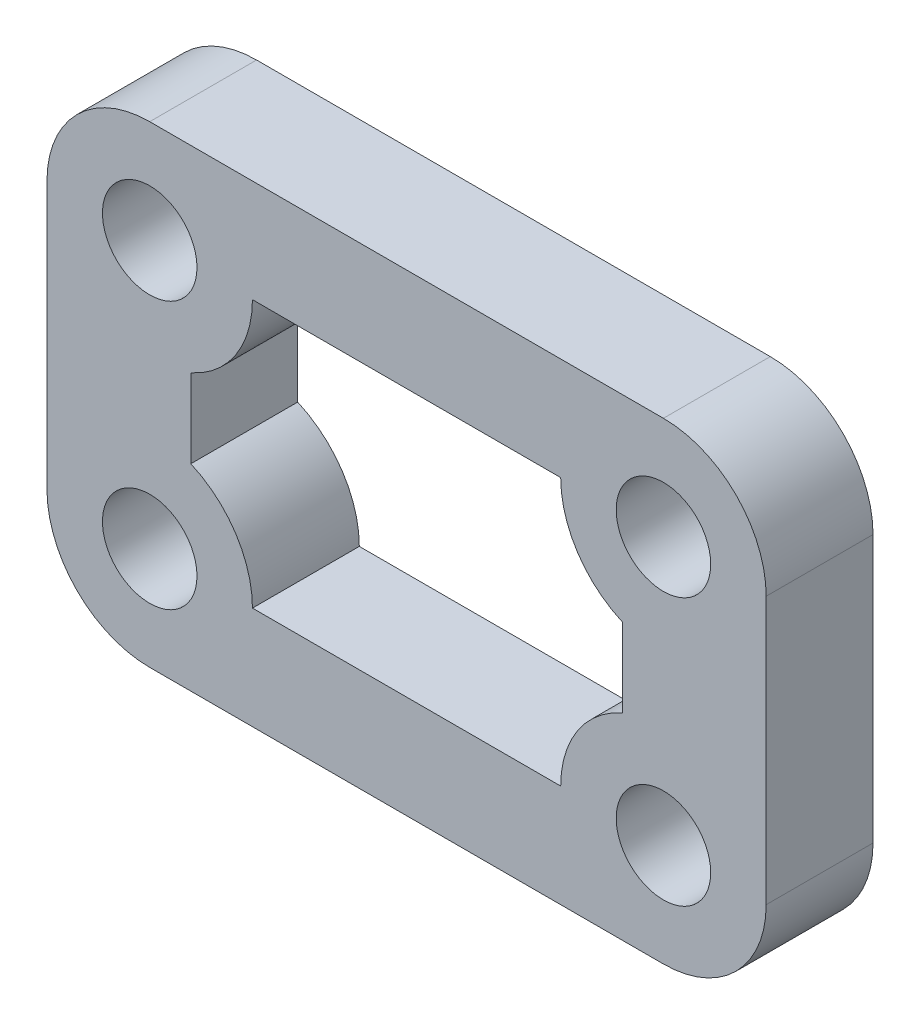
ISO-10303-21;
HEADER;
FILE_DESCRIPTION(('STEP AP214'),'2;1');
FILE_NAME('part.step','',(''),(''),'','','');
FILE_SCHEMA(('AUTOMOTIVE_DESIGN { 1 0 10303 214 1 1 1 1 }'));
ENDSEC;
DATA;
#1=APPLICATION_CONTEXT('core data for automotive mechanical design processes');
#2=APPLICATION_PROTOCOL_DEFINITION('international standard','automotive_design',2000,#1);
#3=PRODUCT_CONTEXT('',#1,'mechanical');
#4=PRODUCT('Part','Part','',(#3));
#5=PRODUCT_RELATED_PRODUCT_CATEGORY('part','',(#4));
#6=PRODUCT_DEFINITION_FORMATION('','',#4);
#7=PRODUCT_DEFINITION_CONTEXT('part definition',#1,'design');
#8=PRODUCT_DEFINITION('design','',#6,#7);
#9=PRODUCT_DEFINITION_SHAPE('','',#8);
#10=(LENGTH_UNIT() NAMED_UNIT(*) SI_UNIT(.MILLI.,.METRE.));
#11=(NAMED_UNIT(*) PLANE_ANGLE_UNIT() SI_UNIT($,.RADIAN.));
#12=(NAMED_UNIT(*) SI_UNIT($,.STERADIAN.) SOLID_ANGLE_UNIT());
#13=UNCERTAINTY_MEASURE_WITH_UNIT(LENGTH_MEASURE(1.E-05),#10,'distance_accuracy_value','');
#14=(GEOMETRIC_REPRESENTATION_CONTEXT(3) GLOBAL_UNCERTAINTY_ASSIGNED_CONTEXT((#13)) GLOBAL_UNIT_ASSIGNED_CONTEXT((#10,
#11,#12)) REPRESENTATION_CONTEXT('',''));
#15=CARTESIAN_POINT('',(0.,0.,0.));
#16=DIRECTION('',(0.,0.,1.));
#17=DIRECTION('',(1.,0.,0.));
#18=AXIS2_PLACEMENT_3D('',#15,#16,#17);
#19=CARTESIAN_POINT('',(0.,13.,5.2));
#20=DIRECTION('',(0.,0.,1.));
#21=DIRECTION('',(1.,0.,0.));
#22=AXIS2_PLACEMENT_3D('',#19,#20,#21);
#23=PLANE('',#22);
#24=CARTESIAN_POINT('',(0.,0.,5.2));
#25=DIRECTION('',(0.,0.,1.));
#26=DIRECTION('',(1.,0.,0.));
#27=AXIS2_PLACEMENT_3D('',#24,#25,#26);
#28=CIRCLE('',#27,2.3);
#29=CARTESIAN_POINT('',(2.3,0.,5.2));
#30=VERTEX_POINT('',#29);
#31=EDGE_CURVE('E220',#30,#30,#28,.T.);
#32=ORIENTED_EDGE('',*,*,#31,.F.);
#33=EDGE_LOOP('',(#32));
#34=FACE_BOUND('',#33,.T.);
#35=CARTESIAN_POINT('',(0.,13.,5.2));
#36=DIRECTION('',(0.,0.,1.));
#37=DIRECTION('',(1.,0.,0.));
#38=AXIS2_PLACEMENT_3D('',#35,#36,#37);
#39=CIRCLE('',#38,2.3);
#40=CARTESIAN_POINT('',(2.3,13.,5.2));
#41=VERTEX_POINT('',#40);
#42=EDGE_CURVE('E232',#41,#41,#39,.T.);
#43=ORIENTED_EDGE('',*,*,#42,.F.);
#44=EDGE_LOOP('',(#43));
#45=FACE_BOUND('',#44,.T.);
#46=CARTESIAN_POINT('',(0.,13.,5.2));
#47=DIRECTION('',(0.,0.,1.));
#48=DIRECTION('',(1.,0.,0.));
#49=AXIS2_PLACEMENT_3D('',#46,#47,#48);
#50=CIRCLE('',#49,5.);
#51=CARTESIAN_POINT('',(0.,18.,5.2));
#52=VERTEX_POINT('',#51);
#53=CARTESIAN_POINT('',(-5.,13.,5.2));
#54=VERTEX_POINT('',#53);
#55=EDGE_CURVE('E238',#52,#54,#50,.T.);
#56=ORIENTED_EDGE('',*,*,#55,.T.);
#57=DIRECTION('',(0.,-1.,0.));
#58=VECTOR('',#57,1.);
#59=CARTESIAN_POINT('',(-5.,13.,5.2));
#60=LINE('',#59,#58);
#61=CARTESIAN_POINT('',(-5.,0.,5.2));
#62=VERTEX_POINT('',#61);
#63=EDGE_CURVE('E241',#54,#62,#60,.T.);
#64=ORIENTED_EDGE('',*,*,#63,.T.);
#65=CARTESIAN_POINT('',(0.,0.,5.2));
#66=DIRECTION('',(0.,0.,1.));
#67=DIRECTION('',(1.,0.,0.));
#68=AXIS2_PLACEMENT_3D('',#65,#66,#67);
#69=CIRCLE('',#68,5.);
#70=CARTESIAN_POINT('',(0.,-5.,5.2));
#71=VERTEX_POINT('',#70);
#72=EDGE_CURVE('E244',#62,#71,#69,.T.);
#73=ORIENTED_EDGE('',*,*,#72,.T.);
#74=DIRECTION('',(1.,0.,0.));
#75=VECTOR('',#74,1.);
#76=CARTESIAN_POINT('',(0.,-5.,5.2));
#77=LINE('',#76,#75);
#78=CARTESIAN_POINT('',(25.,-5.,5.2));
#79=VERTEX_POINT('',#78);
#80=EDGE_CURVE('E246',#71,#79,#77,.T.);
#81=ORIENTED_EDGE('',*,*,#80,.T.);
#82=CARTESIAN_POINT('',(25.,0.,5.2));
#83=DIRECTION('',(0.,0.,1.));
#84=DIRECTION('',(1.,0.,0.));
#85=AXIS2_PLACEMENT_3D('',#82,#83,#84);
#86=CIRCLE('',#85,5.);
#87=CARTESIAN_POINT('',(30.,0.,5.2));
#88=VERTEX_POINT('',#87);
#89=EDGE_CURVE('E248',#79,#88,#86,.T.);
#90=ORIENTED_EDGE('',*,*,#89,.T.);
#91=DIRECTION('',(0.,1.,0.));
#92=VECTOR('',#91,1.);
#93=CARTESIAN_POINT('',(30.,13.,5.2));
#94=LINE('',#93,#92);
#95=CARTESIAN_POINT('',(30.,13.,5.2));
#96=VERTEX_POINT('',#95);
#97=EDGE_CURVE('E250',#88,#96,#94,.T.);
#98=ORIENTED_EDGE('',*,*,#97,.T.);
#99=CARTESIAN_POINT('',(25.,13.,5.2));
#100=DIRECTION('',(0.,0.,1.));
#101=DIRECTION('',(1.,0.,0.));
#102=AXIS2_PLACEMENT_3D('',#99,#100,#101);
#103=CIRCLE('',#102,5.);
#104=CARTESIAN_POINT('',(25.,18.,5.2));
#105=VERTEX_POINT('',#104);
#106=EDGE_CURVE('E252',#96,#105,#103,.T.);
#107=ORIENTED_EDGE('',*,*,#106,.T.);
#108=DIRECTION('',(-1.,0.,0.));
#109=VECTOR('',#108,1.);
#110=CARTESIAN_POINT('',(25.,18.,5.2));
#111=LINE('',#110,#109);
#112=EDGE_CURVE('E254',#105,#52,#111,.T.);
#113=ORIENTED_EDGE('',*,*,#112,.T.);
#114=EDGE_LOOP('',(#56,#64,#73,#81,#90,#98,#107,#113));
#115=FACE_BOUND('',#114,.T.);
#116=CARTESIAN_POINT('',(25.,13.,5.2));
#117=DIRECTION('',(0.,0.,1.));
#118=DIRECTION('',(1.,0.,0.));
#119=AXIS2_PLACEMENT_3D('',#116,#117,#118);
#120=CIRCLE('',#119,2.3);
#121=CARTESIAN_POINT('',(27.3,13.,5.2));
#122=VERTEX_POINT('',#121);
#123=EDGE_CURVE('E226',#122,#122,#120,.T.);
#124=ORIENTED_EDGE('',*,*,#123,.F.);
#125=EDGE_LOOP('',(#124));
#126=FACE_BOUND('',#125,.T.);
#127=CARTESIAN_POINT('',(25.,0.,5.2));
#128=DIRECTION('',(0.,0.,1.));
#129=DIRECTION('',(1.,0.,0.));
#130=AXIS2_PLACEMENT_3D('',#127,#128,#129);
#131=CIRCLE('',#130,2.3);
#132=CARTESIAN_POINT('',(27.3,0.,5.2));
#133=VERTEX_POINT('',#132);
#134=EDGE_CURVE('E214',#133,#133,#131,.T.);
#135=ORIENTED_EDGE('',*,*,#134,.F.);
#136=EDGE_LOOP('',(#135));
#137=FACE_BOUND('',#136,.T.);
#138=DIRECTION('',(0.,-1.,0.));
#139=VECTOR('',#138,1.);
#140=CARTESIAN_POINT('',(2.,8.41742430504416,5.2));
#141=LINE('',#140,#139);
#142=CARTESIAN_POINT('',(2.,8.41742430504416,5.2));
#143=VERTEX_POINT('',#142);
#144=CARTESIAN_POINT('',(2.,4.58257569495584,5.2));
#145=VERTEX_POINT('',#144);
#146=EDGE_CURVE('E157',#143,#145,#141,.T.);
#147=ORIENTED_EDGE('',*,*,#146,.F.);
#148=CARTESIAN_POINT('',(0.,13.,5.2));
#149=DIRECTION('',(0.,0.,-1.));
#150=DIRECTION('',(1.,0.,0.));
#151=AXIS2_PLACEMENT_3D('',#148,#149,#150);
#152=CIRCLE('',#151,5.);
#153=CARTESIAN_POINT('',(5.,13.,5.2));
#154=VERTEX_POINT('',#153);
#155=EDGE_CURVE('E149',#154,#143,#152,.T.);
#156=ORIENTED_EDGE('',*,*,#155,.F.);
#157=DIRECTION('',(-1.,0.,0.));
#158=VECTOR('',#157,1.);
#159=CARTESIAN_POINT('',(5.,13.,5.2));
#160=LINE('',#159,#158);
#161=CARTESIAN_POINT('',(20.,13.,5.2));
#162=VERTEX_POINT('',#161);
#163=EDGE_CURVE('E182',#162,#154,#160,.T.);
#164=ORIENTED_EDGE('',*,*,#163,.F.);
#165=CARTESIAN_POINT('',(25.,13.,5.2));
#166=DIRECTION('',(0.,0.,-1.));
#167=DIRECTION('',(1.,0.,0.));
#168=AXIS2_PLACEMENT_3D('',#165,#166,#167);
#169=CIRCLE('',#168,5.);
#170=CARTESIAN_POINT('',(23.,8.41742430504416,5.2));
#171=VERTEX_POINT('',#170);
#172=EDGE_CURVE('E180',#171,#162,#169,.T.);
#173=ORIENTED_EDGE('',*,*,#172,.F.);
#174=DIRECTION('',(0.,1.,0.));
#175=VECTOR('',#174,1.);
#176=CARTESIAN_POINT('',(23.,8.41742430504416,5.2));
#177=LINE('',#176,#175);
#178=CARTESIAN_POINT('',(23.,4.58257569495584,5.2));
#179=VERTEX_POINT('',#178);
#180=EDGE_CURVE('E178',#179,#171,#177,.T.);
#181=ORIENTED_EDGE('',*,*,#180,.F.);
#182=CARTESIAN_POINT('',(25.,0.,5.2));
#183=DIRECTION('',(0.,0.,-1.));
#184=DIRECTION('',(1.,0.,0.));
#185=AXIS2_PLACEMENT_3D('',#182,#183,#184);
#186=CIRCLE('',#185,5.);
#187=CARTESIAN_POINT('',(20.,0.,5.2));
#188=VERTEX_POINT('',#187);
#189=EDGE_CURVE('E176',#188,#179,#186,.T.);
#190=ORIENTED_EDGE('',*,*,#189,.F.);
#191=DIRECTION('',(1.,0.,0.));
#192=VECTOR('',#191,1.);
#193=CARTESIAN_POINT('',(5.,0.,5.2));
#194=LINE('',#193,#192);
#195=CARTESIAN_POINT('',(5.,0.,5.2));
#196=VERTEX_POINT('',#195);
#197=EDGE_CURVE('E172',#196,#188,#194,.T.);
#198=ORIENTED_EDGE('',*,*,#197,.F.);
#199=CARTESIAN_POINT('',(0.,0.,5.2));
#200=DIRECTION('',(0.,0.,-1.));
#201=DIRECTION('',(1.,0.,0.));
#202=AXIS2_PLACEMENT_3D('',#199,#200,#201);
#203=CIRCLE('',#202,5.);
#204=EDGE_CURVE('E170',#145,#196,#203,.T.);
#205=ORIENTED_EDGE('',*,*,#204,.F.);
#206=EDGE_LOOP('',(#147,#156,#164,#173,#181,#190,#198,#205));
#207=FACE_BOUND('',#206,.T.);
#208=ADVANCED_FACE('F36',(#34,#45,#115,#126,#137,#207),#23,.T.);
#209=CARTESIAN_POINT('',(0.,13.,0.));
#210=DIRECTION('',(0.,0.,1.));
#211=DIRECTION('',(1.,0.,0.));
#212=AXIS2_PLACEMENT_3D('',#209,#210,#211);
#213=PLANE('',#212);
#214=CARTESIAN_POINT('',(25.,0.,0.));
#215=DIRECTION('',(0.,0.,1.));
#216=DIRECTION('',(1.,0.,0.));
#217=AXIS2_PLACEMENT_3D('',#214,#215,#216);
#218=CIRCLE('',#217,2.3);
#219=CARTESIAN_POINT('',(27.3,0.,0.));
#220=VERTEX_POINT('',#219);
#221=EDGE_CURVE('E165',#220,#220,#218,.T.);
#222=ORIENTED_EDGE('',*,*,#221,.T.);
#223=EDGE_LOOP('',(#222));
#224=FACE_BOUND('',#223,.T.);
#225=CARTESIAN_POINT('',(0.,0.,0.));
#226=DIRECTION('',(0.,0.,1.));
#227=DIRECTION('',(1.,0.,0.));
#228=AXIS2_PLACEMENT_3D('',#225,#226,#227);
#229=CIRCLE('',#228,2.3);
#230=CARTESIAN_POINT('',(2.3,0.,0.));
#231=VERTEX_POINT('',#230);
#232=EDGE_CURVE('E217',#231,#231,#229,.T.);
#233=ORIENTED_EDGE('',*,*,#232,.T.);
#234=EDGE_LOOP('',(#233));
#235=FACE_BOUND('',#234,.T.);
#236=CARTESIAN_POINT('',(25.,13.,0.));
#237=DIRECTION('',(0.,0.,1.));
#238=DIRECTION('',(1.,0.,0.));
#239=AXIS2_PLACEMENT_3D('',#236,#237,#238);
#240=CIRCLE('',#239,2.3);
#241=CARTESIAN_POINT('',(27.3,13.,0.));
#242=VERTEX_POINT('',#241);
#243=EDGE_CURVE('E223',#242,#242,#240,.T.);
#244=ORIENTED_EDGE('',*,*,#243,.T.);
#245=EDGE_LOOP('',(#244));
#246=FACE_BOUND('',#245,.T.);
#247=CARTESIAN_POINT('',(0.,13.,0.));
#248=DIRECTION('',(0.,0.,1.));
#249=DIRECTION('',(1.,0.,0.));
#250=AXIS2_PLACEMENT_3D('',#247,#248,#249);
#251=CIRCLE('',#250,2.3);
#252=CARTESIAN_POINT('',(2.3,13.,0.));
#253=VERTEX_POINT('',#252);
#254=EDGE_CURVE('E229',#253,#253,#251,.T.);
#255=ORIENTED_EDGE('',*,*,#254,.T.);
#256=EDGE_LOOP('',(#255));
#257=FACE_BOUND('',#256,.T.);
#258=CARTESIAN_POINT('',(0.,13.,0.));
#259=DIRECTION('',(0.,0.,1.));
#260=DIRECTION('',(1.,0.,0.));
#261=AXIS2_PLACEMENT_3D('',#258,#259,#260);
#262=CIRCLE('',#261,5.);
#263=CARTESIAN_POINT('',(0.,18.,0.));
#264=VERTEX_POINT('',#263);
#265=CARTESIAN_POINT('',(-5.,13.,0.));
#266=VERTEX_POINT('',#265);
#267=EDGE_CURVE('E235',#264,#266,#262,.T.);
#268=ORIENTED_EDGE('',*,*,#267,.F.);
#269=DIRECTION('',(-1.,0.,0.));
#270=VECTOR('',#269,1.);
#271=CARTESIAN_POINT('',(25.,18.,0.));
#272=LINE('',#271,#270);
#273=CARTESIAN_POINT('',(25.,18.,0.));
#274=VERTEX_POINT('',#273);
#275=EDGE_CURVE('E242',#274,#264,#272,.T.);
#276=ORIENTED_EDGE('',*,*,#275,.F.);
#277=CARTESIAN_POINT('',(25.,13.,0.));
#278=DIRECTION('',(0.,0.,1.));
#279=DIRECTION('',(1.,0.,0.));
#280=AXIS2_PLACEMENT_3D('',#277,#278,#279);
#281=CIRCLE('',#280,5.);
#282=CARTESIAN_POINT('',(30.,13.,0.));
#283=VERTEX_POINT('',#282);
#284=EDGE_CURVE('E269',#283,#274,#281,.T.);
#285=ORIENTED_EDGE('',*,*,#284,.F.);
#286=DIRECTION('',(0.,1.,0.));
#287=VECTOR('',#286,1.);
#288=CARTESIAN_POINT('',(30.,13.,0.));
#289=LINE('',#288,#287);
#290=CARTESIAN_POINT('',(30.,0.,0.));
#291=VERTEX_POINT('',#290);
#292=EDGE_CURVE('E267',#291,#283,#289,.T.);
#293=ORIENTED_EDGE('',*,*,#292,.F.);
#294=CARTESIAN_POINT('',(25.,0.,0.));
#295=DIRECTION('',(0.,0.,1.));
#296=DIRECTION('',(1.,0.,0.));
#297=AXIS2_PLACEMENT_3D('',#294,#295,#296);
#298=CIRCLE('',#297,5.);
#299=CARTESIAN_POINT('',(25.,-5.,0.));
#300=VERTEX_POINT('',#299);
#301=EDGE_CURVE('E265',#300,#291,#298,.T.);
#302=ORIENTED_EDGE('',*,*,#301,.F.);
#303=DIRECTION('',(1.,0.,0.));
#304=VECTOR('',#303,1.);
#305=CARTESIAN_POINT('',(0.,-5.,0.));
#306=LINE('',#305,#304);
#307=CARTESIAN_POINT('',(0.,-5.,0.));
#308=VERTEX_POINT('',#307);
#309=EDGE_CURVE('E263',#308,#300,#306,.T.);
#310=ORIENTED_EDGE('',*,*,#309,.F.);
#311=CARTESIAN_POINT('',(0.,0.,0.));
#312=DIRECTION('',(0.,0.,1.));
#313=DIRECTION('',(1.,0.,0.));
#314=AXIS2_PLACEMENT_3D('',#311,#312,#313);
#315=CIRCLE('',#314,5.);
#316=CARTESIAN_POINT('',(-5.,0.,0.));
#317=VERTEX_POINT('',#316);
#318=EDGE_CURVE('E261',#317,#308,#315,.T.);
#319=ORIENTED_EDGE('',*,*,#318,.F.);
#320=DIRECTION('',(0.,-1.,0.));
#321=VECTOR('',#320,1.);
#322=CARTESIAN_POINT('',(-5.,13.,0.));
#323=LINE('',#322,#321);
#324=EDGE_CURVE('E259',#266,#317,#323,.T.);
#325=ORIENTED_EDGE('',*,*,#324,.F.);
#326=EDGE_LOOP('',(#268,#276,#285,#293,#302,#310,#319,#325));
#327=FACE_BOUND('',#326,.T.);
#328=CARTESIAN_POINT('',(0.,13.,0.));
#329=DIRECTION('',(0.,0.,-1.));
#330=DIRECTION('',(1.,0.,0.));
#331=AXIS2_PLACEMENT_3D('',#328,#329,#330);
#332=CIRCLE('',#331,5.);
#333=CARTESIAN_POINT('',(5.,13.,0.));
#334=VERTEX_POINT('',#333);
#335=CARTESIAN_POINT('',(2.,8.41742430504416,0.));
#336=VERTEX_POINT('',#335);
#337=EDGE_CURVE('E59',#334,#336,#332,.T.);
#338=ORIENTED_EDGE('',*,*,#337,.T.);
#339=DIRECTION('',(0.,-1.,0.));
#340=VECTOR('',#339,1.);
#341=CARTESIAN_POINT('',(2.,8.41742430504416,0.));
#342=LINE('',#341,#340);
#343=CARTESIAN_POINT('',(2.,4.58257569495584,0.));
#344=VERTEX_POINT('',#343);
#345=EDGE_CURVE('E164',#336,#344,#342,.T.);
#346=ORIENTED_EDGE('',*,*,#345,.T.);
#347=CARTESIAN_POINT('',(0.,0.,0.));
#348=DIRECTION('',(0.,0.,-1.));
#349=DIRECTION('',(1.,0.,0.));
#350=AXIS2_PLACEMENT_3D('',#347,#348,#349);
#351=CIRCLE('',#350,5.);
#352=CARTESIAN_POINT('',(5.,0.,0.));
#353=VERTEX_POINT('',#352);
#354=EDGE_CURVE('E186',#344,#353,#351,.T.);
#355=ORIENTED_EDGE('',*,*,#354,.T.);
#356=DIRECTION('',(1.,0.,0.));
#357=VECTOR('',#356,1.);
#358=CARTESIAN_POINT('',(5.,0.,0.));
#359=LINE('',#358,#357);
#360=CARTESIAN_POINT('',(20.,0.,0.));
#361=VERTEX_POINT('',#360);
#362=EDGE_CURVE('E189',#353,#361,#359,.T.);
#363=ORIENTED_EDGE('',*,*,#362,.T.);
#364=CARTESIAN_POINT('',(25.,0.,0.));
#365=DIRECTION('',(0.,0.,-1.));
#366=DIRECTION('',(1.,0.,0.));
#367=AXIS2_PLACEMENT_3D('',#364,#365,#366);
#368=CIRCLE('',#367,5.);
#369=CARTESIAN_POINT('',(23.,4.58257569495584,0.));
#370=VERTEX_POINT('',#369);
#371=EDGE_CURVE('E192',#361,#370,#368,.T.);
#372=ORIENTED_EDGE('',*,*,#371,.T.);
#373=DIRECTION('',(0.,1.,0.));
#374=VECTOR('',#373,1.);
#375=CARTESIAN_POINT('',(23.,8.41742430504416,0.));
#376=LINE('',#375,#374);
#377=CARTESIAN_POINT('',(23.,8.41742430504416,0.));
#378=VERTEX_POINT('',#377);
#379=EDGE_CURVE('E195',#370,#378,#376,.T.);
#380=ORIENTED_EDGE('',*,*,#379,.T.);
#381=CARTESIAN_POINT('',(25.,13.,0.));
#382=DIRECTION('',(0.,0.,-1.));
#383=DIRECTION('',(1.,0.,0.));
#384=AXIS2_PLACEMENT_3D('',#381,#382,#383);
#385=CIRCLE('',#384,5.);
#386=CARTESIAN_POINT('',(20.,13.,0.));
#387=VERTEX_POINT('',#386);
#388=EDGE_CURVE('E198',#378,#387,#385,.T.);
#389=ORIENTED_EDGE('',*,*,#388,.T.);
#390=DIRECTION('',(-1.,0.,0.));
#391=VECTOR('',#390,1.);
#392=CARTESIAN_POINT('',(5.,13.,0.));
#393=LINE('',#392,#391);
#394=EDGE_CURVE('E158',#387,#334,#393,.T.);
#395=ORIENTED_EDGE('',*,*,#394,.T.);
#396=EDGE_LOOP('',(#338,#346,#355,#363,#372,#380,#389,#395));
#397=FACE_BOUND('',#396,.T.);
#398=ADVANCED_FACE('F299',(#224,#235,#246,#257,#327,#397),#213,.F.);
#399=CARTESIAN_POINT('',(0.,13.,5.2));
#400=DIRECTION('',(0.,0.,-1.));
#401=DIRECTION('',(-1.,0.,0.));
#402=AXIS2_PLACEMENT_3D('',#399,#400,#401);
#403=CYLINDRICAL_SURFACE('',#402,5.);
#404=ORIENTED_EDGE('',*,*,#267,.T.);
#405=DIRECTION('',(0.,0.,-1.));
#406=VECTOR('',#405,1.);
#407=CARTESIAN_POINT('',(-5.,13.,5.2));
#408=LINE('',#407,#406);
#409=EDGE_CURVE('E11',#54,#266,#408,.T.);
#410=ORIENTED_EDGE('',*,*,#409,.F.);
#411=ORIENTED_EDGE('',*,*,#55,.F.);
#412=DIRECTION('',(0.,0.,-1.));
#413=VECTOR('',#412,1.);
#414=CARTESIAN_POINT('',(0.,18.,5.2));
#415=LINE('',#414,#413);
#416=EDGE_CURVE('E256',#52,#264,#415,.T.);
#417=ORIENTED_EDGE('',*,*,#416,.T.);
#418=EDGE_LOOP('',(#404,#410,#411,#417));
#419=FACE_BOUND('',#418,.T.);
#420=ADVANCED_FACE('F38',(#419),#403,.T.);
#421=CARTESIAN_POINT('',(-5.,13.,5.2));
#422=DIRECTION('',(1.,0.,0.));
#423=DIRECTION('',(0.,1.,0.));
#424=AXIS2_PLACEMENT_3D('',#421,#422,#423);
#425=PLANE('',#424);
#426=ORIENTED_EDGE('',*,*,#324,.T.);
#427=DIRECTION('',(0.,0.,-1.));
#428=VECTOR('',#427,1.);
#429=CARTESIAN_POINT('',(-5.,0.,5.2));
#430=LINE('',#429,#428);
#431=EDGE_CURVE('E44',#62,#317,#430,.T.);
#432=ORIENTED_EDGE('',*,*,#431,.F.);
#433=ORIENTED_EDGE('',*,*,#63,.F.);
#434=ORIENTED_EDGE('',*,*,#409,.T.);
#435=EDGE_LOOP('',(#426,#432,#433,#434));
#436=FACE_BOUND('',#435,.T.);
#437=ADVANCED_FACE('F317',(#436),#425,.F.);
#438=CARTESIAN_POINT('',(0.,0.,5.2));
#439=DIRECTION('',(0.,0.,-1.));
#440=DIRECTION('',(-1.,0.,0.));
#441=AXIS2_PLACEMENT_3D('',#438,#439,#440);
#442=CYLINDRICAL_SURFACE('',#441,5.);
#443=ORIENTED_EDGE('',*,*,#318,.T.);
#444=DIRECTION('',(0.,0.,-1.));
#445=VECTOR('',#444,1.);
#446=CARTESIAN_POINT('',(0.,-5.,5.2));
#447=LINE('',#446,#445);
#448=EDGE_CURVE('E286',#71,#308,#447,.T.);
#449=ORIENTED_EDGE('',*,*,#448,.F.);
#450=ORIENTED_EDGE('',*,*,#72,.F.);
#451=ORIENTED_EDGE('',*,*,#431,.T.);
#452=EDGE_LOOP('',(#443,#449,#450,#451));
#453=FACE_BOUND('',#452,.T.);
#454=ADVANCED_FACE('F293',(#453),#442,.T.);
#455=CARTESIAN_POINT('',(0.,-5.,5.2));
#456=DIRECTION('',(0.,1.,0.));
#457=DIRECTION('',(0.,0.,1.));
#458=AXIS2_PLACEMENT_3D('',#455,#456,#457);
#459=PLANE('',#458);
#460=ORIENTED_EDGE('',*,*,#309,.T.);
#461=DIRECTION('',(0.,0.,-1.));
#462=VECTOR('',#461,1.);
#463=CARTESIAN_POINT('',(25.,-5.,5.2));
#464=LINE('',#463,#462);
#465=EDGE_CURVE('E283',#79,#300,#464,.T.);
#466=ORIENTED_EDGE('',*,*,#465,.F.);
#467=ORIENTED_EDGE('',*,*,#80,.F.);
#468=ORIENTED_EDGE('',*,*,#448,.T.);
#469=EDGE_LOOP('',(#460,#466,#467,#468));
#470=FACE_BOUND('',#469,.T.);
#471=ADVANCED_FACE('F305',(#470),#459,.F.);
#472=CARTESIAN_POINT('',(25.,0.,5.2));
#473=DIRECTION('',(0.,0.,-1.));
#474=DIRECTION('',(-1.,0.,0.));
#475=AXIS2_PLACEMENT_3D('',#472,#473,#474);
#476=CYLINDRICAL_SURFACE('',#475,5.);
#477=ORIENTED_EDGE('',*,*,#301,.T.);
#478=DIRECTION('',(0.,0.,-1.));
#479=VECTOR('',#478,1.);
#480=CARTESIAN_POINT('',(30.,0.,5.2));
#481=LINE('',#480,#479);
#482=EDGE_CURVE('E280',#88,#291,#481,.T.);
#483=ORIENTED_EDGE('',*,*,#482,.F.);
#484=ORIENTED_EDGE('',*,*,#89,.F.);
#485=ORIENTED_EDGE('',*,*,#465,.T.);
#486=EDGE_LOOP('',(#477,#483,#484,#485));
#487=FACE_BOUND('',#486,.T.);
#488=ADVANCED_FACE('F309',(#487),#476,.T.);
#489=CARTESIAN_POINT('',(30.,13.,5.2));
#490=DIRECTION('',(-1.,0.,0.));
#491=DIRECTION('',(0.,0.,1.));
#492=AXIS2_PLACEMENT_3D('',#489,#490,#491);
#493=PLANE('',#492);
#494=ORIENTED_EDGE('',*,*,#292,.T.);
#495=DIRECTION('',(0.,0.,-1.));
#496=VECTOR('',#495,1.);
#497=CARTESIAN_POINT('',(30.,13.,5.2));
#498=LINE('',#497,#496);
#499=EDGE_CURVE('E277',#96,#283,#498,.T.);
#500=ORIENTED_EDGE('',*,*,#499,.F.);
#501=ORIENTED_EDGE('',*,*,#97,.F.);
#502=ORIENTED_EDGE('',*,*,#482,.T.);
#503=EDGE_LOOP('',(#494,#500,#501,#502));
#504=FACE_BOUND('',#503,.T.);
#505=ADVANCED_FACE('F330',(#504),#493,.F.);
#506=CARTESIAN_POINT('',(25.,13.,5.2));
#507=DIRECTION('',(0.,0.,-1.));
#508=DIRECTION('',(-1.,0.,0.));
#509=AXIS2_PLACEMENT_3D('',#506,#507,#508);
#510=CYLINDRICAL_SURFACE('',#509,5.);
#511=ORIENTED_EDGE('',*,*,#284,.T.);
#512=DIRECTION('',(0.,0.,-1.));
#513=VECTOR('',#512,1.);
#514=CARTESIAN_POINT('',(25.,18.,5.2));
#515=LINE('',#514,#513);
#516=EDGE_CURVE('E274',#105,#274,#515,.T.);
#517=ORIENTED_EDGE('',*,*,#516,.F.);
#518=ORIENTED_EDGE('',*,*,#106,.F.);
#519=ORIENTED_EDGE('',*,*,#499,.T.);
#520=EDGE_LOOP('',(#511,#517,#518,#519));
#521=FACE_BOUND('',#520,.T.);
#522=ADVANCED_FACE('F328',(#521),#510,.T.);
#523=CARTESIAN_POINT('',(25.,18.,5.2));
#524=DIRECTION('',(0.,-1.,0.));
#525=DIRECTION('',(0.,0.,-1.));
#526=AXIS2_PLACEMENT_3D('',#523,#524,#525);
#527=PLANE('',#526);
#528=ORIENTED_EDGE('',*,*,#275,.T.);
#529=ORIENTED_EDGE('',*,*,#416,.F.);
#530=ORIENTED_EDGE('',*,*,#112,.F.);
#531=ORIENTED_EDGE('',*,*,#516,.T.);
#532=EDGE_LOOP('',(#528,#529,#530,#531));
#533=FACE_BOUND('',#532,.T.);
#534=ADVANCED_FACE('F323',(#533),#527,.F.);
#535=CARTESIAN_POINT('',(0.,13.,5.2));
#536=DIRECTION('',(0.,0.,-1.));
#537=DIRECTION('',(-1.,0.,0.));
#538=AXIS2_PLACEMENT_3D('',#535,#536,#537);
#539=CYLINDRICAL_SURFACE('',#538,2.3);
#540=ORIENTED_EDGE('',*,*,#42,.T.);
#541=EDGE_LOOP('',(#540));
#542=FACE_BOUND('',#541,.T.);
#543=ORIENTED_EDGE('',*,*,#254,.F.);
#544=EDGE_LOOP('',(#543));
#545=FACE_BOUND('',#544,.T.);
#546=ADVANCED_FACE('F350',(#542,#545),#539,.F.);
#547=CARTESIAN_POINT('',(25.,13.,5.2));
#548=DIRECTION('',(0.,0.,-1.));
#549=DIRECTION('',(-1.,0.,0.));
#550=AXIS2_PLACEMENT_3D('',#547,#548,#549);
#551=CYLINDRICAL_SURFACE('',#550,2.3);
#552=ORIENTED_EDGE('',*,*,#123,.T.);
#553=EDGE_LOOP('',(#552));
#554=FACE_BOUND('',#553,.T.);
#555=ORIENTED_EDGE('',*,*,#243,.F.);
#556=EDGE_LOOP('',(#555));
#557=FACE_BOUND('',#556,.T.);
#558=ADVANCED_FACE('F357',(#554,#557),#551,.F.);
#559=CARTESIAN_POINT('',(0.,0.,5.2));
#560=DIRECTION('',(0.,0.,-1.));
#561=DIRECTION('',(-1.,0.,0.));
#562=AXIS2_PLACEMENT_3D('',#559,#560,#561);
#563=CYLINDRICAL_SURFACE('',#562,2.3);
#564=ORIENTED_EDGE('',*,*,#31,.T.);
#565=EDGE_LOOP('',(#564));
#566=FACE_BOUND('',#565,.T.);
#567=ORIENTED_EDGE('',*,*,#232,.F.);
#568=EDGE_LOOP('',(#567));
#569=FACE_BOUND('',#568,.T.);
#570=ADVANCED_FACE('F362',(#566,#569),#563,.F.);
#571=CARTESIAN_POINT('',(25.,0.,5.2));
#572=DIRECTION('',(0.,0.,-1.));
#573=DIRECTION('',(-1.,0.,0.));
#574=AXIS2_PLACEMENT_3D('',#571,#572,#573);
#575=CYLINDRICAL_SURFACE('',#574,2.3);
#576=ORIENTED_EDGE('',*,*,#134,.T.);
#577=EDGE_LOOP('',(#576));
#578=FACE_BOUND('',#577,.T.);
#579=ORIENTED_EDGE('',*,*,#221,.F.);
#580=EDGE_LOOP('',(#579));
#581=FACE_BOUND('',#580,.T.);
#582=ADVANCED_FACE('F371',(#578,#581),#575,.F.);
#583=CARTESIAN_POINT('',(0.,13.,5.2));
#584=DIRECTION('',(0.,0.,-1.));
#585=DIRECTION('',(-1.,0.,0.));
#586=AXIS2_PLACEMENT_3D('',#583,#584,#585);
#587=CYLINDRICAL_SURFACE('',#586,5.);
#588=ORIENTED_EDGE('',*,*,#337,.F.);
#589=DIRECTION('',(0.,0.,-1.));
#590=VECTOR('',#589,1.);
#591=CARTESIAN_POINT('',(5.,13.,5.2));
#592=LINE('',#591,#590);
#593=EDGE_CURVE('E153',#154,#334,#592,.T.);
#594=ORIENTED_EDGE('',*,*,#593,.F.);
#595=ORIENTED_EDGE('',*,*,#155,.T.);
#596=DIRECTION('',(0.,0.,-1.));
#597=VECTOR('',#596,1.);
#598=CARTESIAN_POINT('',(2.,8.41742430504416,5.2));
#599=LINE('',#598,#597);
#600=EDGE_CURVE('E152',#143,#336,#599,.T.);
#601=ORIENTED_EDGE('',*,*,#600,.T.);
#602=EDGE_LOOP('',(#588,#594,#595,#601));
#603=FACE_BOUND('',#602,.T.);
#604=ADVANCED_FACE('F151',(#603),#587,.T.);
#605=CARTESIAN_POINT('',(2.,8.41742430504416,5.2));
#606=DIRECTION('',(1.,0.,0.));
#607=DIRECTION('',(0.,0.,-1.));
#608=AXIS2_PLACEMENT_3D('',#605,#606,#607);
#609=PLANE('',#608);
#610=ORIENTED_EDGE('',*,*,#345,.F.);
#611=ORIENTED_EDGE('',*,*,#600,.F.);
#612=ORIENTED_EDGE('',*,*,#146,.T.);
#613=DIRECTION('',(0.,0.,-1.));
#614=VECTOR('',#613,1.);
#615=CARTESIAN_POINT('',(2.,4.58257569495584,5.2));
#616=LINE('',#615,#614);
#617=EDGE_CURVE('E166',#145,#344,#616,.T.);
#618=ORIENTED_EDGE('',*,*,#617,.T.);
#619=EDGE_LOOP('',(#610,#611,#612,#618));
#620=FACE_BOUND('',#619,.T.);
#621=ADVANCED_FACE('F161',(#620),#609,.T.);
#622=CARTESIAN_POINT('',(0.,0.,5.2));
#623=DIRECTION('',(0.,0.,-1.));
#624=DIRECTION('',(-1.,0.,0.));
#625=AXIS2_PLACEMENT_3D('',#622,#623,#624);
#626=CYLINDRICAL_SURFACE('',#625,5.);
#627=ORIENTED_EDGE('',*,*,#354,.F.);
#628=ORIENTED_EDGE('',*,*,#617,.F.);
#629=ORIENTED_EDGE('',*,*,#204,.T.);
#630=DIRECTION('',(0.,0.,-1.));
#631=VECTOR('',#630,1.);
#632=CARTESIAN_POINT('',(5.,0.,5.2));
#633=LINE('',#632,#631);
#634=EDGE_CURVE('E211',#196,#353,#633,.T.);
#635=ORIENTED_EDGE('',*,*,#634,.T.);
#636=EDGE_LOOP('',(#627,#628,#629,#635));
#637=FACE_BOUND('',#636,.T.);
#638=ADVANCED_FACE('F383',(#637),#626,.T.);
#639=CARTESIAN_POINT('',(5.,0.,5.2));
#640=DIRECTION('',(0.,1.,0.));
#641=DIRECTION('',(0.,0.,1.));
#642=AXIS2_PLACEMENT_3D('',#639,#640,#641);
#643=PLANE('',#642);
#644=ORIENTED_EDGE('',*,*,#362,.F.);
#645=ORIENTED_EDGE('',*,*,#634,.F.);
#646=ORIENTED_EDGE('',*,*,#197,.T.);
#647=DIRECTION('',(0.,0.,-1.));
#648=VECTOR('',#647,1.);
#649=CARTESIAN_POINT('',(20.,0.,5.2));
#650=LINE('',#649,#648);
#651=EDGE_CURVE('E209',#188,#361,#650,.T.);
#652=ORIENTED_EDGE('',*,*,#651,.T.);
#653=EDGE_LOOP('',(#644,#645,#646,#652));
#654=FACE_BOUND('',#653,.T.);
#655=ADVANCED_FACE('F386',(#654),#643,.T.);
#656=CARTESIAN_POINT('',(25.,0.,5.2));
#657=DIRECTION('',(0.,0.,-1.));
#658=DIRECTION('',(-1.,0.,0.));
#659=AXIS2_PLACEMENT_3D('',#656,#657,#658);
#660=CYLINDRICAL_SURFACE('',#659,5.);
#661=ORIENTED_EDGE('',*,*,#371,.F.);
#662=ORIENTED_EDGE('',*,*,#651,.F.);
#663=ORIENTED_EDGE('',*,*,#189,.T.);
#664=DIRECTION('',(0.,0.,-1.));
#665=VECTOR('',#664,1.);
#666=CARTESIAN_POINT('',(23.,4.58257569495584,5.2));
#667=LINE('',#666,#665);
#668=EDGE_CURVE('E207',#179,#370,#667,.T.);
#669=ORIENTED_EDGE('',*,*,#668,.T.);
#670=EDGE_LOOP('',(#661,#662,#663,#669));
#671=FACE_BOUND('',#670,.T.);
#672=ADVANCED_FACE('F390',(#671),#660,.T.);
#673=CARTESIAN_POINT('',(23.,8.41742430504416,5.2));
#674=DIRECTION('',(-1.,0.,0.));
#675=DIRECTION('',(0.,-1.,0.));
#676=AXIS2_PLACEMENT_3D('',#673,#674,#675);
#677=PLANE('',#676);
#678=ORIENTED_EDGE('',*,*,#379,.F.);
#679=ORIENTED_EDGE('',*,*,#668,.F.);
#680=ORIENTED_EDGE('',*,*,#180,.T.);
#681=DIRECTION('',(0.,0.,-1.));
#682=VECTOR('',#681,1.);
#683=CARTESIAN_POINT('',(23.,8.41742430504416,5.2));
#684=LINE('',#683,#682);
#685=EDGE_CURVE('E205',#171,#378,#684,.T.);
#686=ORIENTED_EDGE('',*,*,#685,.T.);
#687=EDGE_LOOP('',(#678,#679,#680,#686));
#688=FACE_BOUND('',#687,.T.);
#689=ADVANCED_FACE('F394',(#688),#677,.T.);
#690=CARTESIAN_POINT('',(25.,13.,5.2));
#691=DIRECTION('',(0.,0.,-1.));
#692=DIRECTION('',(-1.,0.,0.));
#693=AXIS2_PLACEMENT_3D('',#690,#691,#692);
#694=CYLINDRICAL_SURFACE('',#693,5.);
#695=ORIENTED_EDGE('',*,*,#388,.F.);
#696=ORIENTED_EDGE('',*,*,#685,.F.);
#697=ORIENTED_EDGE('',*,*,#172,.T.);
#698=DIRECTION('',(0.,0.,-1.));
#699=VECTOR('',#698,1.);
#700=CARTESIAN_POINT('',(20.,13.,5.2));
#701=LINE('',#700,#699);
#702=EDGE_CURVE('E51',#162,#387,#701,.T.);
#703=ORIENTED_EDGE('',*,*,#702,.T.);
#704=EDGE_LOOP('',(#695,#696,#697,#703));
#705=FACE_BOUND('',#704,.T.);
#706=ADVANCED_FACE('F398',(#705),#694,.T.);
#707=CARTESIAN_POINT('',(5.,13.,5.2));
#708=DIRECTION('',(0.,-1.,0.));
#709=DIRECTION('',(0.,0.,-1.));
#710=AXIS2_PLACEMENT_3D('',#707,#708,#709);
#711=PLANE('',#710);
#712=ORIENTED_EDGE('',*,*,#394,.F.);
#713=ORIENTED_EDGE('',*,*,#702,.F.);
#714=ORIENTED_EDGE('',*,*,#163,.T.);
#715=ORIENTED_EDGE('',*,*,#593,.T.);
#716=EDGE_LOOP('',(#712,#713,#714,#715));
#717=FACE_BOUND('',#716,.T.);
#718=ADVANCED_FACE('F402',(#717),#711,.T.);
#719=CLOSED_SHELL('',(#208,#398,#420,#437,#454,#471,#488,#505,#522,#534,#546,#558,#570,#582,
#604,#621,#638,#655,#672,#689,#706,#718));
#720=MANIFOLD_SOLID_BREP('B2',#719);
#721=ADVANCED_BREP_SHAPE_REPRESENTATION('',(#18,#720),#14);
#722=SHAPE_DEFINITION_REPRESENTATION(#9,#721);
ENDSEC;
END-ISO-10303-21;
